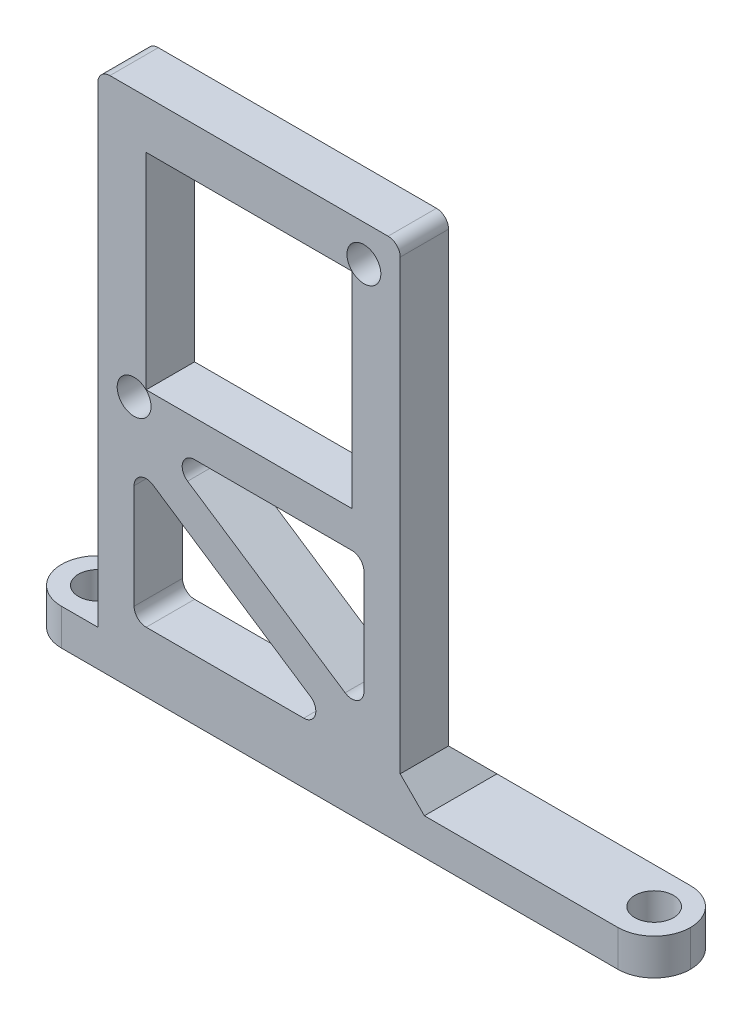
ISO-10303-21;
HEADER;
FILE_DESCRIPTION(('STEP AP214'),'2;1');
FILE_NAME('part.step','',(''),(''),'','','');
FILE_SCHEMA(('AUTOMOTIVE_DESIGN { 1 0 10303 214 1 1 1 1 }'));
ENDSEC;
DATA;
#1=APPLICATION_CONTEXT('core data for automotive mechanical design processes');
#2=APPLICATION_PROTOCOL_DEFINITION('international standard','automotive_design',2000,#1);
#3=PRODUCT_CONTEXT('',#1,'mechanical');
#4=PRODUCT('Part','Part','',(#3));
#5=PRODUCT_RELATED_PRODUCT_CATEGORY('part','',(#4));
#6=PRODUCT_DEFINITION_FORMATION('','',#4);
#7=PRODUCT_DEFINITION_CONTEXT('part definition',#1,'design');
#8=PRODUCT_DEFINITION('design','',#6,#7);
#9=PRODUCT_DEFINITION_SHAPE('','',#8);
#10=(LENGTH_UNIT() NAMED_UNIT(*) SI_UNIT(.MILLI.,.METRE.));
#11=(NAMED_UNIT(*) PLANE_ANGLE_UNIT() SI_UNIT($,.RADIAN.));
#12=(NAMED_UNIT(*) SI_UNIT($,.STERADIAN.) SOLID_ANGLE_UNIT());
#13=UNCERTAINTY_MEASURE_WITH_UNIT(LENGTH_MEASURE(1.E-05),#10,'distance_accuracy_value','');
#14=(GEOMETRIC_REPRESENTATION_CONTEXT(3) GLOBAL_UNCERTAINTY_ASSIGNED_CONTEXT((#13)) GLOBAL_UNIT_ASSIGNED_CONTEXT((#10,
#11,#12)) REPRESENTATION_CONTEXT('',''));
#15=CARTESIAN_POINT('',(0.,0.,0.));
#16=DIRECTION('',(0.,0.,1.));
#17=DIRECTION('',(1.,0.,0.));
#18=AXIS2_PLACEMENT_3D('',#15,#16,#17);
#19=CARTESIAN_POINT('',(0.,3.,0.));
#20=DIRECTION('',(0.,-1.,0.));
#21=DIRECTION('',(0.,0.,-1.));
#22=AXIS2_PLACEMENT_3D('',#19,#20,#21);
#23=PLANE('',#22);
#24=CARTESIAN_POINT('',(23.,3.,0.));
#25=DIRECTION('',(0.,1.,0.));
#26=DIRECTION('',(0.,0.,1.));
#27=AXIS2_PLACEMENT_3D('',#24,#25,#26);
#28=CIRCLE('',#27,1.6);
#29=CARTESIAN_POINT('',(23.,3.,1.6));
#30=VERTEX_POINT('',#29);
#31=EDGE_CURVE('E273',#30,#30,#28,.T.);
#32=ORIENTED_EDGE('',*,*,#31,.F.);
#33=EDGE_LOOP('',(#32));
#34=FACE_BOUND('',#33,.T.);
#35=DIRECTION('',(-1.,0.,0.));
#36=VECTOR('',#35,1.);
#37=CARTESIAN_POINT('',(26.,3.,-3.));
#38=LINE('',#37,#36);
#39=CARTESIAN_POINT('',(23.,3.,-3.));
#40=VERTEX_POINT('',#39);
#41=CARTESIAN_POINT('',(7.00000000000001,3.,-3.));
#42=VERTEX_POINT('',#41);
#43=EDGE_CURVE('E303',#40,#42,#38,.T.);
#44=ORIENTED_EDGE('',*,*,#43,.T.);
#45=DIRECTION('',(0.,0.,1.));
#46=VECTOR('',#45,1.);
#47=CARTESIAN_POINT('',(7.00000000000001,3.,3.));
#48=LINE('',#47,#46);
#49=CARTESIAN_POINT('',(7.00000000000001,3.,3.));
#50=VERTEX_POINT('',#49);
#51=EDGE_CURVE('E333',#42,#50,#48,.T.);
#52=ORIENTED_EDGE('',*,*,#51,.T.);
#53=DIRECTION('',(1.,0.,0.));
#54=VECTOR('',#53,1.);
#55=CARTESIAN_POINT('',(26.,3.,3.));
#56=LINE('',#55,#54);
#57=CARTESIAN_POINT('',(23.,3.,3.));
#58=VERTEX_POINT('',#57);
#59=EDGE_CURVE('E320',#50,#58,#56,.T.);
#60=ORIENTED_EDGE('',*,*,#59,.T.);
#61=CARTESIAN_POINT('',(23.,3.,0.));
#62=DIRECTION('',(0.,-1.,0.));
#63=DIRECTION('',(0.,0.,-1.));
#64=AXIS2_PLACEMENT_3D('',#61,#62,#63);
#65=CIRCLE('',#64,3.);
#66=CARTESIAN_POINT('',(26.,3.,0.));
#67=VERTEX_POINT('',#66);
#68=EDGE_CURVE('E863',#58,#67,#65,.F.);
#69=ORIENTED_EDGE('',*,*,#68,.T.);
#70=CARTESIAN_POINT('',(23.,3.,0.));
#71=DIRECTION('',(0.,-1.,0.));
#72=DIRECTION('',(0.,0.,-1.));
#73=AXIS2_PLACEMENT_3D('',#70,#71,#72);
#74=CIRCLE('',#73,3.);
#75=EDGE_CURVE('E867',#67,#40,#74,.F.);
#76=ORIENTED_EDGE('',*,*,#75,.T.);
#77=EDGE_LOOP('',(#44,#52,#60,#69,#76));
#78=FACE_BOUND('',#77,.T.);
#79=ADVANCED_FACE('F35',(#34,#78),#23,.F.);
#80=CARTESIAN_POINT('',(-23.,3.,0.));
#81=DIRECTION('',(0.,1.,0.));
#82=DIRECTION('',(0.,0.,1.));
#83=AXIS2_PLACEMENT_3D('',#80,#81,#82);
#84=CIRCLE('',#83,1.6);
#85=CARTESIAN_POINT('',(-23.,3.,1.6));
#86=VERTEX_POINT('',#85);
#87=EDGE_CURVE('E272',#86,#86,#84,.T.);
#88=ORIENTED_EDGE('',*,*,#87,.F.);
#89=EDGE_LOOP('',(#88));
#90=FACE_BOUND('',#89,.T.);
#91=DIRECTION('',(0.,0.,1.));
#92=VECTOR('',#91,1.);
#93=CARTESIAN_POINT('',(-20.,3.,-0.999999999999997));
#94=LINE('',#93,#92);
#95=CARTESIAN_POINT('',(-20.,3.,-3.));
#96=VERTEX_POINT('',#95);
#97=CARTESIAN_POINT('',(-20.,3.,3.));
#98=VERTEX_POINT('',#97);
#99=EDGE_CURVE('E280',#96,#98,#94,.T.);
#100=ORIENTED_EDGE('',*,*,#99,.F.);
#101=CARTESIAN_POINT('',(-23.,3.,-3.));
#102=VERTEX_POINT('',#101);
#103=EDGE_CURVE('E319',#96,#102,#38,.T.);
#104=ORIENTED_EDGE('',*,*,#103,.T.);
#105=CARTESIAN_POINT('',(-23.,3.,0.));
#106=DIRECTION('',(0.,-1.,0.));
#107=DIRECTION('',(0.,0.,-1.));
#108=AXIS2_PLACEMENT_3D('',#105,#106,#107);
#109=CIRCLE('',#108,3.);
#110=CARTESIAN_POINT('',(-26.,3.,0.));
#111=VERTEX_POINT('',#110);
#112=EDGE_CURVE('E314',#102,#111,#109,.F.);
#113=ORIENTED_EDGE('',*,*,#112,.T.);
#114=CARTESIAN_POINT('',(-23.,3.,0.));
#115=DIRECTION('',(0.,-1.,0.));
#116=DIRECTION('',(0.,0.,-1.));
#117=AXIS2_PLACEMENT_3D('',#114,#115,#116);
#118=CIRCLE('',#117,3.);
#119=CARTESIAN_POINT('',(-23.,3.,3.));
#120=VERTEX_POINT('',#119);
#121=EDGE_CURVE('E880',#111,#120,#118,.F.);
#122=ORIENTED_EDGE('',*,*,#121,.T.);
#123=EDGE_CURVE('E315',#120,#98,#56,.T.);
#124=ORIENTED_EDGE('',*,*,#123,.T.);
#125=EDGE_LOOP('',(#100,#104,#113,#122,#124));
#126=FACE_BOUND('',#125,.T.);
#127=ADVANCED_FACE('F545',(#90,#126),#23,.F.);
#128=CARTESIAN_POINT('',(26.,3.,3.));
#129=DIRECTION('',(0.,0.,-1.));
#130=DIRECTION('',(-1.,0.,0.));
#131=AXIS2_PLACEMENT_3D('',#128,#129,#130);
#132=PLANE('',#131);
#133=DIRECTION('',(0.833414355075511,-0.55264863408324,0.));
#134=VECTOR('',#133,1.);
#135=CARTESIAN_POINT('',(19.0847076162344,-7.42851386348771,3.));
#136=LINE('',#135,#134);
#137=CARTESIAN_POINT('',(-15.4473513659167,15.4701740608865,3.));
#138=VERTEX_POINT('',#137);
#139=CARTESIAN_POINT('',(-2.42280181265317,6.83341435507553,3.));
#140=VERTEX_POINT('',#139);
#141=EDGE_CURVE('E515',#138,#140,#136,.T.);
#142=ORIENTED_EDGE('',*,*,#141,.T.);
#143=CARTESIAN_POINT('',(-2.9754504467364,6.00000000000002,3.));
#144=DIRECTION('',(0.,0.,-1.));
#145=DIRECTION('',(-1.,0.,0.));
#146=AXIS2_PLACEMENT_3D('',#143,#144,#145);
#147=CIRCLE('',#146,1.);
#148=CARTESIAN_POINT('',(-2.9754504467364,5.00000000000002,3.));
#149=VERTEX_POINT('',#148);
#150=EDGE_CURVE('E422',#140,#149,#147,.T.);
#151=ORIENTED_EDGE('',*,*,#150,.T.);
#152=DIRECTION('',(-1.,0.,0.));
#153=VECTOR('',#152,1.);
#154=CARTESIAN_POINT('',(26.,5.00000000000002,3.));
#155=LINE('',#154,#153);
#156=CARTESIAN_POINT('',(-16.,5.00000000000002,3.));
#157=VERTEX_POINT('',#156);
#158=EDGE_CURVE('E511',#149,#157,#155,.T.);
#159=ORIENTED_EDGE('',*,*,#158,.T.);
#160=CARTESIAN_POINT('',(-16.,6.00000000000002,3.));
#161=DIRECTION('',(0.,0.,-1.));
#162=DIRECTION('',(-1.,0.,0.));
#163=AXIS2_PLACEMENT_3D('',#160,#161,#162);
#164=CIRCLE('',#163,1.);
#165=CARTESIAN_POINT('',(-17.,6.00000000000002,3.));
#166=VERTEX_POINT('',#165);
#167=EDGE_CURVE('E414',#157,#166,#164,.T.);
#168=ORIENTED_EDGE('',*,*,#167,.T.);
#169=DIRECTION('',(0.,1.,0.));
#170=VECTOR('',#169,1.);
#171=CARTESIAN_POINT('',(-17.,2.99999999999999,3.));
#172=LINE('',#171,#170);
#173=CARTESIAN_POINT('',(-17.,14.636759705811,3.));
#174=VERTEX_POINT('',#173);
#175=EDGE_CURVE('E518',#166,#174,#172,.T.);
#176=ORIENTED_EDGE('',*,*,#175,.T.);
#177=CARTESIAN_POINT('',(-16.,14.636759705811,3.));
#178=DIRECTION('',(0.,0.,-1.));
#179=DIRECTION('',(-1.,0.,0.));
#180=AXIS2_PLACEMENT_3D('',#177,#178,#179);
#181=CIRCLE('',#180,1.);
#182=EDGE_CURVE('E418',#174,#138,#181,.T.);
#183=ORIENTED_EDGE('',*,*,#182,.T.);
#184=EDGE_LOOP('',(#142,#151,#159,#168,#176,#183));
#185=FACE_BOUND('',#184,.T.);
#186=DIRECTION('',(0.,-1.,0.));
#187=VECTOR('',#186,1.);
#188=CARTESIAN_POINT('',(2.00000000000001,3.,3.));
#189=LINE('',#188,#187);
#190=CARTESIAN_POINT('',(2.00000000000001,18.,3.));
#191=VERTEX_POINT('',#190);
#192=CARTESIAN_POINT('',(2.00000000000001,9.36324029418904,3.));
#193=VERTEX_POINT('',#192);
#194=EDGE_CURVE('E449',#191,#193,#189,.T.);
#195=ORIENTED_EDGE('',*,*,#194,.T.);
#196=CARTESIAN_POINT('',(1.00000000000001,9.36324029418904,3.));
#197=DIRECTION('',(0.,0.,-1.));
#198=DIRECTION('',(-1.,0.,0.));
#199=AXIS2_PLACEMENT_3D('',#196,#197,#198);
#200=CIRCLE('',#199,1.);
#201=CARTESIAN_POINT('',(0.447351365916761,8.52982593911354,3.));
#202=VERTEX_POINT('',#201);
#203=EDGE_CURVE('E426',#193,#202,#200,.T.);
#204=ORIENTED_EDGE('',*,*,#203,.T.);
#205=DIRECTION('',(-0.833414355075511,0.55264863408324,0.));
#206=VECTOR('',#205,1.);
#207=CARTESIAN_POINT('',(20.7426535184841,-4.92827079826118,3.));
#208=LINE('',#207,#206);
#209=CARTESIAN_POINT('',(-12.5771981873468,17.1665856449245,3.));
#210=VERTEX_POINT('',#209);
#211=EDGE_CURVE('E458',#202,#210,#208,.T.);
#212=ORIENTED_EDGE('',*,*,#211,.T.);
#213=CARTESIAN_POINT('',(-12.0245495532636,18.,3.));
#214=DIRECTION('',(0.,0.,-1.));
#215=DIRECTION('',(-1.,0.,0.));
#216=AXIS2_PLACEMENT_3D('',#213,#214,#215);
#217=CIRCLE('',#216,1.);
#218=CARTESIAN_POINT('',(-12.0245495532636,19.,3.));
#219=VERTEX_POINT('',#218);
#220=EDGE_CURVE('E11',#210,#219,#217,.T.);
#221=ORIENTED_EDGE('',*,*,#220,.T.);
#222=DIRECTION('',(1.,0.,0.));
#223=VECTOR('',#222,1.);
#224=CARTESIAN_POINT('',(26.,19.,3.));
#225=LINE('',#224,#223);
#226=CARTESIAN_POINT('',(1.00000000000001,19.,3.));
#227=VERTEX_POINT('',#226);
#228=EDGE_CURVE('E347',#219,#227,#225,.T.);
#229=ORIENTED_EDGE('',*,*,#228,.T.);
#230=CARTESIAN_POINT('',(1.00000000000001,18.,3.));
#231=DIRECTION('',(0.,0.,-1.));
#232=DIRECTION('',(-1.,0.,0.));
#233=AXIS2_PLACEMENT_3D('',#230,#231,#232);
#234=CIRCLE('',#233,1.);
#235=EDGE_CURVE('E430',#227,#191,#234,.T.);
#236=ORIENTED_EDGE('',*,*,#235,.T.);
#237=EDGE_LOOP('',(#195,#204,#212,#221,#229,#236));
#238=FACE_BOUND('',#237,.T.);
#239=DIRECTION('',(1.,0.,0.));
#240=VECTOR('',#239,1.);
#241=CARTESIAN_POINT('',(-16.,22.,3.));
#242=LINE('',#241,#240);
#243=CARTESIAN_POINT('',(-16.,22.,3.));
#244=VERTEX_POINT('',#243);
#245=CARTESIAN_POINT('',(1.00000000000002,22.,3.));
#246=VERTEX_POINT('',#245);
#247=EDGE_CURVE('E242',#244,#246,#242,.T.);
#248=ORIENTED_EDGE('',*,*,#247,.F.);
#249=DIRECTION('',(0.,-1.,0.));
#250=VECTOR('',#249,1.);
#251=CARTESIAN_POINT('',(-16.,39.,3.));
#252=LINE('',#251,#250);
#253=CARTESIAN_POINT('',(-16.,39.,3.));
#254=VERTEX_POINT('',#253);
#255=EDGE_CURVE('E247',#254,#244,#252,.T.);
#256=ORIENTED_EDGE('',*,*,#255,.F.);
#257=DIRECTION('',(-1.,0.,0.));
#258=VECTOR('',#257,1.);
#259=CARTESIAN_POINT('',(-16.,39.,3.));
#260=LINE('',#259,#258);
#261=CARTESIAN_POINT('',(1.00000000000001,39.,3.));
#262=VERTEX_POINT('',#261);
#263=EDGE_CURVE('E252',#262,#254,#260,.T.);
#264=ORIENTED_EDGE('',*,*,#263,.F.);
#265=DIRECTION('',(0.,1.,0.));
#266=VECTOR('',#265,1.);
#267=CARTESIAN_POINT('',(1.00000000000001,39.,3.));
#268=LINE('',#267,#266);
#269=EDGE_CURVE('E231',#246,#262,#268,.T.);
#270=ORIENTED_EDGE('',*,*,#269,.F.);
#271=EDGE_LOOP('',(#248,#256,#264,#270));
#272=FACE_BOUND('',#271,.T.);
#273=CARTESIAN_POINT('',(-17.,21.,3.));
#274=DIRECTION('',(0.,0.,1.));
#275=DIRECTION('',(1.,0.,0.));
#276=AXIS2_PLACEMENT_3D('',#273,#274,#275);
#277=CIRCLE('',#276,1.4);
#278=CARTESIAN_POINT('',(-15.6,21.,3.));
#279=VERTEX_POINT('',#278);
#280=EDGE_CURVE('E259',#279,#279,#277,.T.);
#281=ORIENTED_EDGE('',*,*,#280,.F.);
#282=EDGE_LOOP('',(#281));
#283=FACE_BOUND('',#282,.T.);
#284=CARTESIAN_POINT('',(2.00000000000002,40.,3.));
#285=DIRECTION('',(0.,0.,1.));
#286=DIRECTION('',(1.,0.,0.));
#287=AXIS2_PLACEMENT_3D('',#284,#285,#286);
#288=CIRCLE('',#287,1.4);
#289=CARTESIAN_POINT('',(3.40000000000002,40.,3.));
#290=VERTEX_POINT('',#289);
#291=EDGE_CURVE('E265',#290,#290,#288,.T.);
#292=ORIENTED_EDGE('',*,*,#291,.F.);
#293=EDGE_LOOP('',(#292));
#294=FACE_BOUND('',#293,.T.);
#295=DIRECTION('',(0.,-1.,0.));
#296=VECTOR('',#295,1.);
#297=CARTESIAN_POINT('',(5.00000000000001,43.,3.));
#298=LINE('',#297,#296);
#299=CARTESIAN_POINT('',(5.00000000000001,42.,3.));
#300=VERTEX_POINT('',#299);
#301=CARTESIAN_POINT('',(5.00000000000001,5.00000000000002,3.));
#302=VERTEX_POINT('',#301);
#303=EDGE_CURVE('E358',#300,#302,#298,.T.);
#304=ORIENTED_EDGE('',*,*,#303,.F.);
#305=CARTESIAN_POINT('',(4.00000000000001,42.,3.));
#306=DIRECTION('',(0.,0.,-1.));
#307=DIRECTION('',(-1.,0.,0.));
#308=AXIS2_PLACEMENT_3D('',#305,#306,#307);
#309=CIRCLE('',#308,1.);
#310=CARTESIAN_POINT('',(4.00000000000001,43.,3.));
#311=VERTEX_POINT('',#310);
#312=EDGE_CURVE('E377',#300,#311,#309,.F.);
#313=ORIENTED_EDGE('',*,*,#312,.T.);
#314=DIRECTION('',(1.,0.,0.));
#315=VECTOR('',#314,1.);
#316=CARTESIAN_POINT('',(-20.,43.,3.));
#317=LINE('',#316,#315);
#318=CARTESIAN_POINT('',(-19.,43.,3.));
#319=VERTEX_POINT('',#318);
#320=EDGE_CURVE('E283',#319,#311,#317,.T.);
#321=ORIENTED_EDGE('',*,*,#320,.F.);
#322=CARTESIAN_POINT('',(-19.,42.,3.));
#323=DIRECTION('',(0.,0.,-1.));
#324=DIRECTION('',(-1.,0.,0.));
#325=AXIS2_PLACEMENT_3D('',#322,#323,#324);
#326=CIRCLE('',#325,1.);
#327=CARTESIAN_POINT('',(-20.,42.,3.));
#328=VERTEX_POINT('',#327);
#329=EDGE_CURVE('E375',#319,#328,#326,.F.);
#330=ORIENTED_EDGE('',*,*,#329,.T.);
#331=DIRECTION('',(0.,-1.,0.));
#332=VECTOR('',#331,1.);
#333=CARTESIAN_POINT('',(-20.,43.,3.));
#334=LINE('',#333,#332);
#335=EDGE_CURVE('E360',#328,#98,#334,.T.);
#336=ORIENTED_EDGE('',*,*,#335,.T.);
#337=ORIENTED_EDGE('',*,*,#123,.F.);
#338=DIRECTION('',(0.,-1.,0.));
#339=VECTOR('',#338,1.);
#340=CARTESIAN_POINT('',(-23.,3.,3.));
#341=LINE('',#340,#339);
#342=CARTESIAN_POINT('',(-23.,0.,3.));
#343=VERTEX_POINT('',#342);
#344=EDGE_CURVE('E884',#120,#343,#341,.T.);
#345=ORIENTED_EDGE('',*,*,#344,.T.);
#346=DIRECTION('',(1.,0.,0.));
#347=VECTOR('',#346,1.);
#348=CARTESIAN_POINT('',(26.,0.,3.));
#349=LINE('',#348,#347);
#350=CARTESIAN_POINT('',(23.,0.,3.));
#351=VERTEX_POINT('',#350);
#352=EDGE_CURVE('E365',#343,#351,#349,.T.);
#353=ORIENTED_EDGE('',*,*,#352,.T.);
#354=DIRECTION('',(0.,-1.,0.));
#355=VECTOR('',#354,1.);
#356=CARTESIAN_POINT('',(23.,3.,3.));
#357=LINE('',#356,#355);
#358=EDGE_CURVE('E478',#351,#58,#357,.F.);
#359=ORIENTED_EDGE('',*,*,#358,.T.);
#360=ORIENTED_EDGE('',*,*,#59,.F.);
#361=DIRECTION('',(0.707106781186543,-0.707106781186552,0.));
#362=VECTOR('',#361,1.);
#363=CARTESIAN_POINT('',(16.4999999999999,-6.5,3.));
#364=LINE('',#363,#362);
#365=EDGE_CURVE('E337',#50,#302,#364,.F.);
#366=ORIENTED_EDGE('',*,*,#365,.T.);
#367=EDGE_LOOP('',(#304,#313,#321,#330,#336,#337,#345,#353,#359,#360,#366));
#368=FACE_BOUND('',#367,.T.);
#369=ADVANCED_FACE('F249',(#185,#238,#272,#283,#294,#368),#132,.F.);
#370=CARTESIAN_POINT('',(26.,3.,-3.));
#371=DIRECTION('',(0.,0.,1.));
#372=DIRECTION('',(1.,0.,0.));
#373=AXIS2_PLACEMENT_3D('',#370,#371,#372);
#374=PLANE('',#373);
#375=ORIENTED_EDGE('',*,*,#43,.F.);
#376=DIRECTION('',(0.,-1.,0.));
#377=VECTOR('',#376,1.);
#378=CARTESIAN_POINT('',(23.,3.,-3.));
#379=LINE('',#378,#377);
#380=CARTESIAN_POINT('',(23.,0.,-3.));
#381=VERTEX_POINT('',#380);
#382=EDGE_CURVE('E302',#40,#381,#379,.T.);
#383=ORIENTED_EDGE('',*,*,#382,.T.);
#384=DIRECTION('',(-1.,0.,0.));
#385=VECTOR('',#384,1.);
#386=CARTESIAN_POINT('',(26.,0.,-3.));
#387=LINE('',#386,#385);
#388=CARTESIAN_POINT('',(-23.,0.,-3.));
#389=VERTEX_POINT('',#388);
#390=EDGE_CURVE('E330',#381,#389,#387,.T.);
#391=ORIENTED_EDGE('',*,*,#390,.T.);
#392=DIRECTION('',(0.,-1.,0.));
#393=VECTOR('',#392,1.);
#394=CARTESIAN_POINT('',(-23.,3.,-3.));
#395=LINE('',#394,#393);
#396=EDGE_CURVE('E299',#389,#102,#395,.F.);
#397=ORIENTED_EDGE('',*,*,#396,.T.);
#398=ORIENTED_EDGE('',*,*,#103,.F.);
#399=EDGE_CURVE('E869',#42,#96,#38,.T.);
#400=ORIENTED_EDGE('',*,*,#399,.F.);
#401=EDGE_LOOP('',(#375,#383,#391,#397,#398,#400));
#402=FACE_BOUND('',#401,.T.);
#403=ADVANCED_FACE('F561',(#402),#374,.F.);
#404=CARTESIAN_POINT('',(0.,0.,0.));
#405=DIRECTION('',(0.,-1.,0.));
#406=DIRECTION('',(0.,0.,-1.));
#407=AXIS2_PLACEMENT_3D('',#404,#405,#406);
#408=PLANE('',#407);
#409=CARTESIAN_POINT('',(23.,0.,0.));
#410=DIRECTION('',(0.,1.,0.));
#411=DIRECTION('',(0.,0.,1.));
#412=AXIS2_PLACEMENT_3D('',#409,#410,#411);
#413=CIRCLE('',#412,1.6);
#414=CARTESIAN_POINT('',(23.,0.,1.6));
#415=VERTEX_POINT('',#414);
#416=EDGE_CURVE('E269',#415,#415,#413,.T.);
#417=ORIENTED_EDGE('',*,*,#416,.T.);
#418=EDGE_LOOP('',(#417));
#419=FACE_BOUND('',#418,.T.);
#420=CARTESIAN_POINT('',(-23.,0.,0.));
#421=DIRECTION('',(0.,1.,0.));
#422=DIRECTION('',(0.,0.,1.));
#423=AXIS2_PLACEMENT_3D('',#420,#421,#422);
#424=CIRCLE('',#423,1.6);
#425=CARTESIAN_POINT('',(-23.,0.,1.6));
#426=VERTEX_POINT('',#425);
#427=EDGE_CURVE('E277',#426,#426,#424,.T.);
#428=ORIENTED_EDGE('',*,*,#427,.T.);
#429=EDGE_LOOP('',(#428));
#430=FACE_BOUND('',#429,.T.);
#431=ORIENTED_EDGE('',*,*,#390,.F.);
#432=CARTESIAN_POINT('',(23.,0.,0.));
#433=DIRECTION('',(0.,-1.,0.));
#434=DIRECTION('',(0.,0.,-1.));
#435=AXIS2_PLACEMENT_3D('',#432,#433,#434);
#436=CIRCLE('',#435,3.);
#437=CARTESIAN_POINT('',(26.,0.,0.));
#438=VERTEX_POINT('',#437);
#439=EDGE_CURVE('E312',#381,#438,#436,.T.);
#440=ORIENTED_EDGE('',*,*,#439,.T.);
#441=CARTESIAN_POINT('',(23.,0.,0.));
#442=DIRECTION('',(0.,-1.,0.));
#443=DIRECTION('',(0.,0.,-1.));
#444=AXIS2_PLACEMENT_3D('',#441,#442,#443);
#445=CIRCLE('',#444,3.);
#446=EDGE_CURVE('E310',#438,#351,#445,.T.);
#447=ORIENTED_EDGE('',*,*,#446,.T.);
#448=ORIENTED_EDGE('',*,*,#352,.F.);
#449=CARTESIAN_POINT('',(-23.,0.,0.));
#450=DIRECTION('',(0.,-1.,0.));
#451=DIRECTION('',(0.,0.,-1.));
#452=AXIS2_PLACEMENT_3D('',#449,#450,#451);
#453=CIRCLE('',#452,3.);
#454=CARTESIAN_POINT('',(-26.,0.,0.));
#455=VERTEX_POINT('',#454);
#456=EDGE_CURVE('E308',#343,#455,#453,.T.);
#457=ORIENTED_EDGE('',*,*,#456,.T.);
#458=CARTESIAN_POINT('',(-23.,0.,0.));
#459=DIRECTION('',(0.,-1.,0.));
#460=DIRECTION('',(0.,0.,-1.));
#461=AXIS2_PLACEMENT_3D('',#458,#459,#460);
#462=CIRCLE('',#461,3.);
#463=EDGE_CURVE('E306',#455,#389,#462,.T.);
#464=ORIENTED_EDGE('',*,*,#463,.T.);
#465=EDGE_LOOP('',(#431,#440,#447,#448,#457,#464));
#466=FACE_BOUND('',#465,.T.);
#467=ADVANCED_FACE('F558',(#419,#430,#466),#408,.T.);
#468=CARTESIAN_POINT('',(-20.,43.,-0.999999999999997));
#469=DIRECTION('',(1.,0.,0.));
#470=DIRECTION('',(0.,0.,-1.));
#471=AXIS2_PLACEMENT_3D('',#468,#469,#470);
#472=PLANE('',#471);
#473=ORIENTED_EDGE('',*,*,#335,.F.);
#474=DIRECTION('',(0.,0.,1.));
#475=VECTOR('',#474,1.);
#476=CARTESIAN_POINT('',(-20.,42.,-0.999999999999997));
#477=LINE('',#476,#475);
#478=CARTESIAN_POINT('',(-20.,42.,-0.999999999999997));
#479=VERTEX_POINT('',#478);
#480=EDGE_CURVE('E379',#328,#479,#477,.F.);
#481=ORIENTED_EDGE('',*,*,#480,.T.);
#482=DIRECTION('',(0.,-1.,0.));
#483=VECTOR('',#482,1.);
#484=CARTESIAN_POINT('',(-20.,43.,-0.999999999999997));
#485=LINE('',#484,#483);
#486=CARTESIAN_POINT('',(-20.,5.00000000000002,-0.999999999999997));
#487=VERTEX_POINT('',#486);
#488=EDGE_CURVE('E289',#479,#487,#485,.T.);
#489=ORIENTED_EDGE('',*,*,#488,.T.);
#490=DIRECTION('',(0.,0.707106781186552,0.707106781186543));
#491=VECTOR('',#490,1.);
#492=CARTESIAN_POINT('',(-20.,24.0000000000002,18.));
#493=LINE('',#492,#491);
#494=EDGE_CURVE('E340',#487,#96,#493,.F.);
#495=ORIENTED_EDGE('',*,*,#494,.T.);
#496=ORIENTED_EDGE('',*,*,#99,.T.);
#497=EDGE_LOOP('',(#473,#481,#489,#495,#496));
#498=FACE_BOUND('',#497,.T.);
#499=ADVANCED_FACE('F556',(#498),#472,.F.);
#500=CARTESIAN_POINT('',(5.00000000000001,43.,-0.999999999999997));
#501=DIRECTION('',(-1.,0.,0.));
#502=DIRECTION('',(0.,0.,1.));
#503=AXIS2_PLACEMENT_3D('',#500,#501,#502);
#504=PLANE('',#503);
#505=DIRECTION('',(0.,-1.,0.));
#506=VECTOR('',#505,1.);
#507=CARTESIAN_POINT('',(5.00000000000001,43.,-0.999999999999997));
#508=LINE('',#507,#506);
#509=CARTESIAN_POINT('',(5.00000000000001,42.,-0.999999999999997));
#510=VERTEX_POINT('',#509);
#511=CARTESIAN_POINT('',(5.00000000000001,5.00000000000002,-0.999999999999997));
#512=VERTEX_POINT('',#511);
#513=EDGE_CURVE('E324',#510,#512,#508,.T.);
#514=ORIENTED_EDGE('',*,*,#513,.F.);
#515=DIRECTION('',(0.,0.,-1.));
#516=VECTOR('',#515,1.);
#517=CARTESIAN_POINT('',(5.00000000000001,42.,3.));
#518=LINE('',#517,#516);
#519=EDGE_CURVE('E357',#510,#300,#518,.F.);
#520=ORIENTED_EDGE('',*,*,#519,.T.);
#521=ORIENTED_EDGE('',*,*,#303,.T.);
#522=DIRECTION('',(0.,0.,-1.));
#523=VECTOR('',#522,1.);
#524=CARTESIAN_POINT('',(5.00000000000001,5.00000000000002,-0.999999999999997));
#525=LINE('',#524,#523);
#526=EDGE_CURVE('E331',#302,#512,#525,.T.);
#527=ORIENTED_EDGE('',*,*,#526,.T.);
#528=EDGE_LOOP('',(#514,#520,#521,#527));
#529=FACE_BOUND('',#528,.T.);
#530=ADVANCED_FACE('F485',(#529),#504,.F.);
#531=CARTESIAN_POINT('',(-20.,43.,-0.999999999999997));
#532=DIRECTION('',(0.,0.,1.));
#533=DIRECTION('',(1.,0.,0.));
#534=AXIS2_PLACEMENT_3D('',#531,#532,#533);
#535=PLANE('',#534);
#536=DIRECTION('',(0.,-1.,0.));
#537=VECTOR('',#536,1.);
#538=CARTESIAN_POINT('',(2.00000000000001,19.,-0.999999999999997));
#539=LINE('',#538,#537);
#540=CARTESIAN_POINT('',(2.00000000000001,18.,-0.999999999999997));
#541=VERTEX_POINT('',#540);
#542=CARTESIAN_POINT('',(2.00000000000001,9.36324029418904,-0.999999999999997));
#543=VERTEX_POINT('',#542);
#544=EDGE_CURVE('E450',#541,#543,#539,.T.);
#545=ORIENTED_EDGE('',*,*,#544,.F.);
#546=CARTESIAN_POINT('',(1.00000000000001,18.,-0.999999999999997));
#547=DIRECTION('',(0.,0.,1.));
#548=DIRECTION('',(1.,0.,0.));
#549=AXIS2_PLACEMENT_3D('',#546,#547,#548);
#550=CIRCLE('',#549,1.);
#551=CARTESIAN_POINT('',(1.00000000000001,19.,-0.999999999999997));
#552=VERTEX_POINT('',#551);
#553=EDGE_CURVE('E428',#541,#552,#550,.T.);
#554=ORIENTED_EDGE('',*,*,#553,.T.);
#555=DIRECTION('',(1.,0.,0.));
#556=VECTOR('',#555,1.);
#557=CARTESIAN_POINT('',(-15.3420540977503,19.,-0.999999999999997));
#558=LINE('',#557,#556);
#559=CARTESIAN_POINT('',(-12.0245495532636,19.,-0.999999999999997));
#560=VERTEX_POINT('',#559);
#561=EDGE_CURVE('E440',#560,#552,#558,.T.);
#562=ORIENTED_EDGE('',*,*,#561,.F.);
#563=CARTESIAN_POINT('',(-12.0245495532636,18.,-0.999999999999997));
#564=DIRECTION('',(0.,0.,1.));
#565=DIRECTION('',(1.,0.,0.));
#566=AXIS2_PLACEMENT_3D('',#563,#564,#565);
#567=CIRCLE('',#566,1.);
#568=CARTESIAN_POINT('',(-12.5771981873468,17.1665856449245,-0.999999999999997));
#569=VERTEX_POINT('',#568);
#570=EDGE_CURVE('E44',#560,#569,#567,.T.);
#571=ORIENTED_EDGE('',*,*,#570,.T.);
#572=DIRECTION('',(-0.833414355075511,0.55264863408324,0.));
#573=VECTOR('',#572,1.);
#574=CARTESIAN_POINT('',(2.00000000000001,7.50024306522655,-0.999999999999997));
#575=LINE('',#574,#573);
#576=CARTESIAN_POINT('',(0.447351365916772,8.52982593911353,-0.999999999999997));
#577=VERTEX_POINT('',#576);
#578=EDGE_CURVE('E438',#577,#569,#575,.T.);
#579=ORIENTED_EDGE('',*,*,#578,.F.);
#580=CARTESIAN_POINT('',(1.00000000000001,9.36324029418904,-0.999999999999997));
#581=DIRECTION('',(0.,0.,1.));
#582=DIRECTION('',(1.,0.,0.));
#583=AXIS2_PLACEMENT_3D('',#580,#581,#582);
#584=CIRCLE('',#583,1.);
#585=EDGE_CURVE('E424',#577,#543,#584,.T.);
#586=ORIENTED_EDGE('',*,*,#585,.T.);
#587=EDGE_LOOP('',(#545,#554,#562,#571,#579,#586));
#588=FACE_BOUND('',#587,.T.);
#589=DIRECTION('',(-1.,0.,0.));
#590=VECTOR('',#589,1.);
#591=CARTESIAN_POINT('',(-20.,39.,-0.999999999999997));
#592=LINE('',#591,#590);
#593=CARTESIAN_POINT('',(1.00000000000001,39.,-0.999999999999997));
#594=VERTEX_POINT('',#593);
#595=CARTESIAN_POINT('',(-16.,39.,-0.999999999999997));
#596=VERTEX_POINT('',#595);
#597=EDGE_CURVE('E473',#594,#596,#592,.T.);
#598=ORIENTED_EDGE('',*,*,#597,.T.);
#599=DIRECTION('',(0.,-1.,0.));
#600=VECTOR('',#599,1.);
#601=CARTESIAN_POINT('',(-16.,43.,-0.999999999999997));
#602=LINE('',#601,#600);
#603=CARTESIAN_POINT('',(-16.,22.,-0.999999999999997));
#604=VERTEX_POINT('',#603);
#605=EDGE_CURVE('E469',#596,#604,#602,.T.);
#606=ORIENTED_EDGE('',*,*,#605,.T.);
#607=DIRECTION('',(1.,0.,0.));
#608=VECTOR('',#607,1.);
#609=CARTESIAN_POINT('',(-20.,22.,-0.999999999999997));
#610=LINE('',#609,#608);
#611=CARTESIAN_POINT('',(1.00000000000001,22.,-0.999999999999997));
#612=VERTEX_POINT('',#611);
#613=EDGE_CURVE('E475',#604,#612,#610,.T.);
#614=ORIENTED_EDGE('',*,*,#613,.T.);
#615=DIRECTION('',(0.,1.,0.));
#616=VECTOR('',#615,1.);
#617=CARTESIAN_POINT('',(1.00000000000001,43.,-0.999999999999997));
#618=LINE('',#617,#616);
#619=EDGE_CURVE('E234',#612,#594,#618,.T.);
#620=ORIENTED_EDGE('',*,*,#619,.T.);
#621=EDGE_LOOP('',(#598,#606,#614,#620));
#622=FACE_BOUND('',#621,.T.);
#623=CARTESIAN_POINT('',(-17.,21.,-0.999999999999997));
#624=DIRECTION('',(0.,0.,1.));
#625=DIRECTION('',(1.,0.,0.));
#626=AXIS2_PLACEMENT_3D('',#623,#624,#625);
#627=CIRCLE('',#626,1.4);
#628=CARTESIAN_POINT('',(-15.6,21.,-0.999999999999997));
#629=VERTEX_POINT('',#628);
#630=EDGE_CURVE('E264',#629,#629,#627,.T.);
#631=ORIENTED_EDGE('',*,*,#630,.T.);
#632=EDGE_LOOP('',(#631));
#633=FACE_BOUND('',#632,.T.);
#634=CARTESIAN_POINT('',(2.00000000000002,40.,-0.999999999999997));
#635=DIRECTION('',(0.,0.,1.));
#636=DIRECTION('',(1.,0.,0.));
#637=AXIS2_PLACEMENT_3D('',#634,#635,#636);
#638=CIRCLE('',#637,1.4);
#639=CARTESIAN_POINT('',(3.40000000000002,40.,-0.999999999999997));
#640=VERTEX_POINT('',#639);
#641=EDGE_CURVE('E268',#640,#640,#638,.T.);
#642=ORIENTED_EDGE('',*,*,#641,.T.);
#643=EDGE_LOOP('',(#642));
#644=FACE_BOUND('',#643,.T.);
#645=DIRECTION('',(-1.,0.,0.));
#646=VECTOR('',#645,1.);
#647=CARTESIAN_POINT('',(-20.,43.,-0.999999999999997));
#648=LINE('',#647,#646);
#649=CARTESIAN_POINT('',(4.00000000000001,43.,-0.999999999999997));
#650=VERTEX_POINT('',#649);
#651=CARTESIAN_POINT('',(-19.,43.,-0.999999999999997));
#652=VERTEX_POINT('',#651);
#653=EDGE_CURVE('E286',#650,#652,#648,.T.);
#654=ORIENTED_EDGE('',*,*,#653,.F.);
#655=CARTESIAN_POINT('',(4.00000000000001,42.,-0.999999999999997));
#656=DIRECTION('',(0.,0.,1.));
#657=DIRECTION('',(1.,0.,0.));
#658=AXIS2_PLACEMENT_3D('',#655,#656,#657);
#659=CIRCLE('',#658,1.);
#660=EDGE_CURVE('E355',#650,#510,#659,.F.);
#661=ORIENTED_EDGE('',*,*,#660,.T.);
#662=ORIENTED_EDGE('',*,*,#513,.T.);
#663=DIRECTION('',(-1.,0.,0.));
#664=VECTOR('',#663,1.);
#665=CARTESIAN_POINT('',(-20.,5.00000000000002,-0.999999999999997));
#666=LINE('',#665,#664);
#667=CARTESIAN_POINT('',(-2.9754504467364,5.00000000000002,-0.999999999999997));
#668=VERTEX_POINT('',#667);
#669=EDGE_CURVE('E335',#512,#668,#666,.T.);
#670=ORIENTED_EDGE('',*,*,#669,.T.);
#671=CARTESIAN_POINT('',(-2.9754504467364,6.00000000000002,-0.999999999999997));
#672=DIRECTION('',(0.,0.,1.));
#673=DIRECTION('',(1.,0.,0.));
#674=AXIS2_PLACEMENT_3D('',#671,#672,#673);
#675=CIRCLE('',#674,1.);
#676=CARTESIAN_POINT('',(-2.42280181265317,6.83341435507553,-0.999999999999997));
#677=VERTEX_POINT('',#676);
#678=EDGE_CURVE('E420',#668,#677,#675,.T.);
#679=ORIENTED_EDGE('',*,*,#678,.T.);
#680=DIRECTION('',(0.833414355075511,-0.55264863408324,0.));
#681=VECTOR('',#680,1.);
#682=CARTESIAN_POINT('',(-17.,16.4997569347735,-0.999999999999997));
#683=LINE('',#682,#681);
#684=CARTESIAN_POINT('',(-15.4473513659167,15.4701740608865,-0.999999999999997));
#685=VERTEX_POINT('',#684);
#686=EDGE_CURVE('E520',#685,#677,#683,.T.);
#687=ORIENTED_EDGE('',*,*,#686,.F.);
#688=CARTESIAN_POINT('',(-16.,14.636759705811,-0.999999999999997));
#689=DIRECTION('',(0.,0.,1.));
#690=DIRECTION('',(1.,0.,0.));
#691=AXIS2_PLACEMENT_3D('',#688,#689,#690);
#692=CIRCLE('',#691,1.);
#693=CARTESIAN_POINT('',(-17.,14.636759705811,-0.999999999999997));
#694=VERTEX_POINT('',#693);
#695=EDGE_CURVE('E416',#685,#694,#692,.T.);
#696=ORIENTED_EDGE('',*,*,#695,.T.);
#697=DIRECTION('',(0.,1.,0.));
#698=VECTOR('',#697,1.);
#699=CARTESIAN_POINT('',(-17.,5.00000000000002,-0.999999999999997));
#700=LINE('',#699,#698);
#701=CARTESIAN_POINT('',(-17.,6.00000000000002,-0.999999999999997));
#702=VERTEX_POINT('',#701);
#703=EDGE_CURVE('E902',#702,#694,#700,.T.);
#704=ORIENTED_EDGE('',*,*,#703,.F.);
#705=CARTESIAN_POINT('',(-16.,6.00000000000002,-0.999999999999997));
#706=DIRECTION('',(0.,0.,1.));
#707=DIRECTION('',(1.,0.,0.));
#708=AXIS2_PLACEMENT_3D('',#705,#706,#707);
#709=CIRCLE('',#708,1.);
#710=CARTESIAN_POINT('',(-16.,5.00000000000002,-0.999999999999997));
#711=VERTEX_POINT('',#710);
#712=EDGE_CURVE('E411',#702,#711,#709,.T.);
#713=ORIENTED_EDGE('',*,*,#712,.T.);
#714=EDGE_CURVE('E50',#711,#487,#666,.T.);
#715=ORIENTED_EDGE('',*,*,#714,.T.);
#716=ORIENTED_EDGE('',*,*,#488,.F.);
#717=CARTESIAN_POINT('',(-19.,42.,-0.999999999999997));
#718=DIRECTION('',(0.,0.,1.));
#719=DIRECTION('',(1.,0.,0.));
#720=AXIS2_PLACEMENT_3D('',#717,#718,#719);
#721=CIRCLE('',#720,1.);
#722=EDGE_CURVE('E353',#479,#652,#721,.F.);
#723=ORIENTED_EDGE('',*,*,#722,.T.);
#724=EDGE_LOOP('',(#654,#661,#662,#670,#679,#687,#696,#704,#713,#715,#716,#723));
#725=FACE_BOUND('',#724,.T.);
#726=ADVANCED_FACE('F436',(#588,#622,#633,#644,#725),#535,.F.);
#727=CARTESIAN_POINT('',(0.,43.,0.));
#728=DIRECTION('',(0.,1.,0.));
#729=DIRECTION('',(0.,0.,1.));
#730=AXIS2_PLACEMENT_3D('',#727,#728,#729);
#731=PLANE('',#730);
#732=ORIENTED_EDGE('',*,*,#320,.T.);
#733=DIRECTION('',(0.,0.,-1.));
#734=VECTOR('',#733,1.);
#735=CARTESIAN_POINT('',(4.00000000000001,43.,-0.999999999999997));
#736=LINE('',#735,#734);
#737=EDGE_CURVE('E350',#311,#650,#736,.T.);
#738=ORIENTED_EDGE('',*,*,#737,.T.);
#739=ORIENTED_EDGE('',*,*,#653,.T.);
#740=DIRECTION('',(0.,0.,1.));
#741=VECTOR('',#740,1.);
#742=CARTESIAN_POINT('',(-19.,43.,3.));
#743=LINE('',#742,#741);
#744=EDGE_CURVE('E343',#652,#319,#743,.T.);
#745=ORIENTED_EDGE('',*,*,#744,.T.);
#746=EDGE_LOOP('',(#732,#738,#739,#745));
#747=FACE_BOUND('',#746,.T.);
#748=ADVANCED_FACE('F793',(#747),#731,.T.);
#749=CARTESIAN_POINT('',(-23.,0.,0.));
#750=DIRECTION('',(0.,1.,0.));
#751=DIRECTION('',(0.,0.,1.));
#752=AXIS2_PLACEMENT_3D('',#749,#750,#751);
#753=CYLINDRICAL_SURFACE('',#752,1.6);
#754=ORIENTED_EDGE('',*,*,#427,.F.);
#755=EDGE_LOOP('',(#754));
#756=FACE_BOUND('',#755,.T.);
#757=ORIENTED_EDGE('',*,*,#87,.T.);
#758=EDGE_LOOP('',(#757));
#759=FACE_BOUND('',#758,.T.);
#760=ADVANCED_FACE('F784',(#756,#759),#753,.F.);
#761=CARTESIAN_POINT('',(23.,0.,0.));
#762=DIRECTION('',(0.,1.,0.));
#763=DIRECTION('',(0.,0.,1.));
#764=AXIS2_PLACEMENT_3D('',#761,#762,#763);
#765=CYLINDRICAL_SURFACE('',#764,1.6);
#766=ORIENTED_EDGE('',*,*,#416,.F.);
#767=EDGE_LOOP('',(#766));
#768=FACE_BOUND('',#767,.T.);
#769=ORIENTED_EDGE('',*,*,#31,.T.);
#770=EDGE_LOOP('',(#769));
#771=FACE_BOUND('',#770,.T.);
#772=ADVANCED_FACE('F576',(#768,#771),#765,.F.);
#773=CARTESIAN_POINT('',(23.,3.,0.));
#774=DIRECTION('',(0.,-1.,0.));
#775=DIRECTION('',(0.,0.,-1.));
#776=AXIS2_PLACEMENT_3D('',#773,#774,#775);
#777=CYLINDRICAL_SURFACE('',#776,3.);
#778=DIRECTION('',(0.,-1.,0.));
#779=VECTOR('',#778,1.);
#780=CARTESIAN_POINT('',(26.,3.,0.));
#781=LINE('',#780,#779);
#782=EDGE_CURVE('E276',#67,#438,#781,.T.);
#783=ORIENTED_EDGE('',*,*,#782,.F.);
#784=ORIENTED_EDGE('',*,*,#68,.F.);
#785=ORIENTED_EDGE('',*,*,#358,.F.);
#786=ORIENTED_EDGE('',*,*,#446,.F.);
#787=EDGE_LOOP('',(#783,#784,#785,#786));
#788=FACE_BOUND('',#787,.T.);
#789=ADVANCED_FACE('F572',(#788),#777,.T.);
#790=CARTESIAN_POINT('',(23.,3.,0.));
#791=DIRECTION('',(0.,-1.,0.));
#792=DIRECTION('',(0.,0.,-1.));
#793=AXIS2_PLACEMENT_3D('',#790,#791,#792);
#794=CYLINDRICAL_SURFACE('',#793,3.);
#795=ORIENTED_EDGE('',*,*,#75,.F.);
#796=ORIENTED_EDGE('',*,*,#782,.T.);
#797=ORIENTED_EDGE('',*,*,#439,.F.);
#798=ORIENTED_EDGE('',*,*,#382,.F.);
#799=EDGE_LOOP('',(#795,#796,#797,#798));
#800=FACE_BOUND('',#799,.T.);
#801=ADVANCED_FACE('F568',(#800),#794,.T.);
#802=CARTESIAN_POINT('',(-23.,3.,0.));
#803=DIRECTION('',(0.,-1.,0.));
#804=DIRECTION('',(0.,0.,-1.));
#805=AXIS2_PLACEMENT_3D('',#802,#803,#804);
#806=CYLINDRICAL_SURFACE('',#805,3.);
#807=DIRECTION('',(0.,-1.,0.));
#808=VECTOR('',#807,1.);
#809=CARTESIAN_POINT('',(-26.,3.,0.));
#810=LINE('',#809,#808);
#811=EDGE_CURVE('E878',#111,#455,#810,.T.);
#812=ORIENTED_EDGE('',*,*,#811,.F.);
#813=ORIENTED_EDGE('',*,*,#112,.F.);
#814=ORIENTED_EDGE('',*,*,#396,.F.);
#815=ORIENTED_EDGE('',*,*,#463,.F.);
#816=EDGE_LOOP('',(#812,#813,#814,#815));
#817=FACE_BOUND('',#816,.T.);
#818=ADVANCED_FACE('F571',(#817),#806,.T.);
#819=CARTESIAN_POINT('',(-23.,3.,0.));
#820=DIRECTION('',(0.,-1.,0.));
#821=DIRECTION('',(0.,0.,-1.));
#822=AXIS2_PLACEMENT_3D('',#819,#820,#821);
#823=CYLINDRICAL_SURFACE('',#822,3.);
#824=ORIENTED_EDGE('',*,*,#121,.F.);
#825=ORIENTED_EDGE('',*,*,#811,.T.);
#826=ORIENTED_EDGE('',*,*,#456,.F.);
#827=ORIENTED_EDGE('',*,*,#344,.F.);
#828=EDGE_LOOP('',(#824,#825,#826,#827));
#829=FACE_BOUND('',#828,.T.);
#830=ADVANCED_FACE('F578',(#829),#823,.T.);
#831=CARTESIAN_POINT('',(2.00000000000002,40.,-3.));
#832=DIRECTION('',(0.,0.,1.));
#833=DIRECTION('',(1.,0.,0.));
#834=AXIS2_PLACEMENT_3D('',#831,#832,#833);
#835=CYLINDRICAL_SURFACE('',#834,1.4);
#836=ORIENTED_EDGE('',*,*,#291,.T.);
#837=EDGE_LOOP('',(#836));
#838=FACE_BOUND('',#837,.T.);
#839=ORIENTED_EDGE('',*,*,#641,.F.);
#840=EDGE_LOOP('',(#839));
#841=FACE_BOUND('',#840,.T.);
#842=ADVANCED_FACE('F581',(#838,#841),#835,.F.);
#843=CARTESIAN_POINT('',(-17.,21.,-3.));
#844=DIRECTION('',(0.,0.,1.));
#845=DIRECTION('',(1.,0.,0.));
#846=AXIS2_PLACEMENT_3D('',#843,#844,#845);
#847=CYLINDRICAL_SURFACE('',#846,1.4);
#848=ORIENTED_EDGE('',*,*,#280,.T.);
#849=EDGE_LOOP('',(#848));
#850=FACE_BOUND('',#849,.T.);
#851=ORIENTED_EDGE('',*,*,#630,.F.);
#852=EDGE_LOOP('',(#851));
#853=FACE_BOUND('',#852,.T.);
#854=ADVANCED_FACE('F739',(#850,#853),#847,.F.);
#855=CARTESIAN_POINT('',(-16.,39.,-3.));
#856=DIRECTION('',(-1.,0.,0.));
#857=DIRECTION('',(0.,-1.,0.));
#858=AXIS2_PLACEMENT_3D('',#855,#856,#857);
#859=PLANE('',#858);
#860=DIRECTION('',(0.,0.,1.));
#861=VECTOR('',#860,1.);
#862=CARTESIAN_POINT('',(-16.,39.,-3.));
#863=LINE('',#862,#861);
#864=EDGE_CURVE('E257',#596,#254,#863,.T.);
#865=ORIENTED_EDGE('',*,*,#864,.T.);
#866=ORIENTED_EDGE('',*,*,#255,.T.);
#867=DIRECTION('',(0.,0.,1.));
#868=VECTOR('',#867,1.);
#869=CARTESIAN_POINT('',(-16.,22.,-3.));
#870=LINE('',#869,#868);
#871=EDGE_CURVE('E238',#604,#244,#870,.T.);
#872=ORIENTED_EDGE('',*,*,#871,.F.);
#873=ORIENTED_EDGE('',*,*,#605,.F.);
#874=EDGE_LOOP('',(#865,#866,#872,#873));
#875=FACE_BOUND('',#874,.T.);
#876=ADVANCED_FACE('F466',(#875),#859,.F.);
#877=CARTESIAN_POINT('',(-16.,39.,-3.));
#878=DIRECTION('',(0.,1.,0.));
#879=DIRECTION('',(0.,0.,1.));
#880=AXIS2_PLACEMENT_3D('',#877,#878,#879);
#881=PLANE('',#880);
#882=DIRECTION('',(0.,0.,1.));
#883=VECTOR('',#882,1.);
#884=CARTESIAN_POINT('',(1.00000000000001,39.,-3.));
#885=LINE('',#884,#883);
#886=EDGE_CURVE('E237',#594,#262,#885,.T.);
#887=ORIENTED_EDGE('',*,*,#886,.T.);
#888=ORIENTED_EDGE('',*,*,#263,.T.);
#889=ORIENTED_EDGE('',*,*,#864,.F.);
#890=ORIENTED_EDGE('',*,*,#597,.F.);
#891=EDGE_LOOP('',(#887,#888,#889,#890));
#892=FACE_BOUND('',#891,.T.);
#893=ADVANCED_FACE('F472',(#892),#881,.F.);
#894=CARTESIAN_POINT('',(1.00000000000001,39.,-3.));
#895=DIRECTION('',(1.,0.,0.));
#896=DIRECTION('',(0.,1.,0.));
#897=AXIS2_PLACEMENT_3D('',#894,#895,#896);
#898=PLANE('',#897);
#899=DIRECTION('',(0.,0.,1.));
#900=VECTOR('',#899,1.);
#901=CARTESIAN_POINT('',(1.00000000000002,22.,-3.));
#902=LINE('',#901,#900);
#903=EDGE_CURVE('E226',#612,#246,#902,.T.);
#904=ORIENTED_EDGE('',*,*,#903,.T.);
#905=ORIENTED_EDGE('',*,*,#269,.T.);
#906=ORIENTED_EDGE('',*,*,#886,.F.);
#907=ORIENTED_EDGE('',*,*,#619,.F.);
#908=EDGE_LOOP('',(#904,#905,#906,#907));
#909=FACE_BOUND('',#908,.T.);
#910=ADVANCED_FACE('F228',(#909),#898,.F.);
#911=CARTESIAN_POINT('',(-16.,22.,-3.));
#912=DIRECTION('',(0.,-1.,0.));
#913=DIRECTION('',(0.,0.,-1.));
#914=AXIS2_PLACEMENT_3D('',#911,#912,#913);
#915=PLANE('',#914);
#916=ORIENTED_EDGE('',*,*,#871,.T.);
#917=ORIENTED_EDGE('',*,*,#247,.T.);
#918=ORIENTED_EDGE('',*,*,#903,.F.);
#919=ORIENTED_EDGE('',*,*,#613,.F.);
#920=EDGE_LOOP('',(#916,#917,#918,#919));
#921=FACE_BOUND('',#920,.T.);
#922=ADVANCED_FACE('F243',(#921),#915,.F.);
#923=CARTESIAN_POINT('',(-20.,5.00000000000002,-0.999999999999997));
#924=DIRECTION('',(0.,0.707106781186543,-0.707106781186552));
#925=DIRECTION('',(1.,0.,0.));
#926=AXIS2_PLACEMENT_3D('',#923,#924,#925);
#927=PLANE('',#926);
#928=ORIENTED_EDGE('',*,*,#494,.F.);
#929=ORIENTED_EDGE('',*,*,#714,.F.);
#930=DIRECTION('',(-1.,0.,0.));
#931=VECTOR('',#930,1.);
#932=CARTESIAN_POINT('',(0.342054097750291,5.00000000000002,-0.999999999999997));
#933=LINE('',#932,#931);
#934=EDGE_CURVE('E496',#668,#711,#933,.T.);
#935=ORIENTED_EDGE('',*,*,#934,.F.);
#936=ORIENTED_EDGE('',*,*,#669,.F.);
#937=DIRECTION('',(0.577350269189623,-0.57735026918963,-0.577350269189624));
#938=VECTOR('',#937,1.);
#939=CARTESIAN_POINT('',(-3.33333333333326,13.3333333333334,7.33333333333327));
#940=LINE('',#939,#938);
#941=EDGE_CURVE('E344',#42,#512,#940,.F.);
#942=ORIENTED_EDGE('',*,*,#941,.F.);
#943=ORIENTED_EDGE('',*,*,#399,.T.);
#944=EDGE_LOOP('',(#928,#929,#935,#936,#942,#943));
#945=FACE_BOUND('',#944,.T.);
#946=ADVANCED_FACE('F495',(#945),#927,.T.);
#947=CARTESIAN_POINT('',(5.00000000000001,5.00000000000002,-0.999999999999997));
#948=DIRECTION('',(0.707106781186552,0.707106781186543,0.));
#949=DIRECTION('',(0.,0.,1.));
#950=AXIS2_PLACEMENT_3D('',#947,#948,#949);
#951=PLANE('',#950);
#952=ORIENTED_EDGE('',*,*,#365,.F.);
#953=ORIENTED_EDGE('',*,*,#51,.F.);
#954=ORIENTED_EDGE('',*,*,#941,.T.);
#955=ORIENTED_EDGE('',*,*,#526,.F.);
#956=EDGE_LOOP('',(#952,#953,#954,#955));
#957=FACE_BOUND('',#956,.T.);
#958=ADVANCED_FACE('F490',(#957),#951,.T.);
#959=CARTESIAN_POINT('',(-15.3420540977503,19.,3.00005));
#960=DIRECTION('',(0.,1.,0.));
#961=DIRECTION('',(-1.,0.,0.));
#962=AXIS2_PLACEMENT_3D('',#959,#960,#961);
#963=PLANE('',#962);
#964=ORIENTED_EDGE('',*,*,#561,.T.);
#965=DIRECTION('',(0.,0.,-1.));
#966=VECTOR('',#965,1.);
#967=CARTESIAN_POINT('',(1.00000000000001,19.,3.));
#968=LINE('',#967,#966);
#969=EDGE_CURVE('E409',#552,#227,#968,.F.);
#970=ORIENTED_EDGE('',*,*,#969,.T.);
#971=ORIENTED_EDGE('',*,*,#228,.F.);
#972=DIRECTION('',(0.,0.,-1.));
#973=VECTOR('',#972,1.);
#974=CARTESIAN_POINT('',(-12.0245495532636,19.,-0.999999999999997));
#975=LINE('',#974,#973);
#976=EDGE_CURVE('E406',#219,#560,#975,.T.);
#977=ORIENTED_EDGE('',*,*,#976,.T.);
#978=EDGE_LOOP('',(#964,#970,#971,#977));
#979=FACE_BOUND('',#978,.T.);
#980=ADVANCED_FACE('F460',(#979),#963,.F.);
#981=CARTESIAN_POINT('',(2.00000000000001,7.50024306522655,3.00005));
#982=DIRECTION('',(-0.55264863408324,-0.833414355075511,0.));
#983=DIRECTION('',(0.833414355075511,-0.55264863408324,0.));
#984=AXIS2_PLACEMENT_3D('',#981,#982,#983);
#985=PLANE('',#984);
#986=ORIENTED_EDGE('',*,*,#211,.F.);
#987=DIRECTION('',(0.,0.,-1.));
#988=VECTOR('',#987,1.);
#989=CARTESIAN_POINT('',(0.447351365916772,8.52982593911353,-0.999999999999997));
#990=LINE('',#989,#988);
#991=EDGE_CURVE('E398',#202,#577,#990,.T.);
#992=ORIENTED_EDGE('',*,*,#991,.T.);
#993=ORIENTED_EDGE('',*,*,#578,.T.);
#994=DIRECTION('',(0.,0.,-1.));
#995=VECTOR('',#994,1.);
#996=CARTESIAN_POINT('',(-12.5771981873468,17.1665856449245,3.));
#997=LINE('',#996,#995);
#998=EDGE_CURVE('E396',#569,#210,#997,.F.);
#999=ORIENTED_EDGE('',*,*,#998,.T.);
#1000=EDGE_LOOP('',(#986,#992,#993,#999));
#1001=FACE_BOUND('',#1000,.T.);
#1002=ADVANCED_FACE('F446',(#1001),#985,.F.);
#1003=CARTESIAN_POINT('',(2.00000000000001,19.,3.00005));
#1004=DIRECTION('',(1.,0.,0.));
#1005=DIRECTION('',(0.,1.,0.));
#1006=AXIS2_PLACEMENT_3D('',#1003,#1004,#1005);
#1007=PLANE('',#1006);
#1008=ORIENTED_EDGE('',*,*,#544,.T.);
#1009=DIRECTION('',(0.,0.,-1.));
#1010=VECTOR('',#1009,1.);
#1011=CARTESIAN_POINT('',(2.00000000000001,9.36324029418904,3.));
#1012=LINE('',#1011,#1010);
#1013=EDGE_CURVE('E404',#543,#193,#1012,.F.);
#1014=ORIENTED_EDGE('',*,*,#1013,.T.);
#1015=ORIENTED_EDGE('',*,*,#194,.F.);
#1016=DIRECTION('',(0.,0.,-1.));
#1017=VECTOR('',#1016,1.);
#1018=CARTESIAN_POINT('',(2.00000000000001,18.,-0.999999999999997));
#1019=LINE('',#1018,#1017);
#1020=EDGE_CURVE('E401',#191,#541,#1019,.T.);
#1021=ORIENTED_EDGE('',*,*,#1020,.T.);
#1022=EDGE_LOOP('',(#1008,#1014,#1015,#1021));
#1023=FACE_BOUND('',#1022,.T.);
#1024=ADVANCED_FACE('F535',(#1023),#1007,.F.);
#1025=CARTESIAN_POINT('',(-17.,5.00000000000002,3.00005));
#1026=DIRECTION('',(-1.,0.,0.));
#1027=DIRECTION('',(0.,-1.,0.));
#1028=AXIS2_PLACEMENT_3D('',#1025,#1026,#1027);
#1029=PLANE('',#1028);
#1030=ORIENTED_EDGE('',*,*,#175,.F.);
#1031=DIRECTION('',(0.,0.,-1.));
#1032=VECTOR('',#1031,1.);
#1033=CARTESIAN_POINT('',(-17.,6.00000000000002,-0.999999999999997));
#1034=LINE('',#1033,#1032);
#1035=EDGE_CURVE('E383',#166,#702,#1034,.T.);
#1036=ORIENTED_EDGE('',*,*,#1035,.T.);
#1037=ORIENTED_EDGE('',*,*,#703,.T.);
#1038=DIRECTION('',(0.,0.,-1.));
#1039=VECTOR('',#1038,1.);
#1040=CARTESIAN_POINT('',(-17.,14.636759705811,3.));
#1041=LINE('',#1040,#1039);
#1042=EDGE_CURVE('E381',#694,#174,#1041,.F.);
#1043=ORIENTED_EDGE('',*,*,#1042,.T.);
#1044=EDGE_LOOP('',(#1030,#1036,#1037,#1043));
#1045=FACE_BOUND('',#1044,.T.);
#1046=ADVANCED_FACE('F664',(#1045),#1029,.F.);
#1047=CARTESIAN_POINT('',(-17.,16.4997569347735,3.00005));
#1048=DIRECTION('',(0.55264863408324,0.833414355075511,0.));
#1049=DIRECTION('',(-0.833414355075511,0.55264863408324,0.));
#1050=AXIS2_PLACEMENT_3D('',#1047,#1048,#1049);
#1051=PLANE('',#1050);
#1052=ORIENTED_EDGE('',*,*,#141,.F.);
#1053=DIRECTION('',(0.,0.,-1.));
#1054=VECTOR('',#1053,1.);
#1055=CARTESIAN_POINT('',(-15.4473513659167,15.4701740608865,-0.999999999999997));
#1056=LINE('',#1055,#1054);
#1057=EDGE_CURVE('E393',#138,#685,#1056,.T.);
#1058=ORIENTED_EDGE('',*,*,#1057,.T.);
#1059=ORIENTED_EDGE('',*,*,#686,.T.);
#1060=DIRECTION('',(0.,0.,-1.));
#1061=VECTOR('',#1060,1.);
#1062=CARTESIAN_POINT('',(-2.42280181265316,6.83341435507553,3.));
#1063=LINE('',#1062,#1061);
#1064=EDGE_CURVE('E391',#677,#140,#1063,.F.);
#1065=ORIENTED_EDGE('',*,*,#1064,.T.);
#1066=EDGE_LOOP('',(#1052,#1058,#1059,#1065));
#1067=FACE_BOUND('',#1066,.T.);
#1068=ADVANCED_FACE('F656',(#1067),#1051,.F.);
#1069=CARTESIAN_POINT('',(0.342054097750291,5.00000000000002,3.00005));
#1070=DIRECTION('',(0.,-1.,0.));
#1071=DIRECTION('',(0.,0.,-1.));
#1072=AXIS2_PLACEMENT_3D('',#1069,#1070,#1071);
#1073=PLANE('',#1072);
#1074=ORIENTED_EDGE('',*,*,#934,.T.);
#1075=DIRECTION('',(0.,0.,-1.));
#1076=VECTOR('',#1075,1.);
#1077=CARTESIAN_POINT('',(-16.,5.00000000000002,3.));
#1078=LINE('',#1077,#1076);
#1079=EDGE_CURVE('E389',#711,#157,#1078,.F.);
#1080=ORIENTED_EDGE('',*,*,#1079,.T.);
#1081=ORIENTED_EDGE('',*,*,#158,.F.);
#1082=DIRECTION('',(0.,0.,-1.));
#1083=VECTOR('',#1082,1.);
#1084=CARTESIAN_POINT('',(-2.9754504467364,5.00000000000002,-0.999999999999997));
#1085=LINE('',#1084,#1083);
#1086=EDGE_CURVE('E386',#149,#668,#1085,.T.);
#1087=ORIENTED_EDGE('',*,*,#1086,.T.);
#1088=EDGE_LOOP('',(#1074,#1080,#1081,#1087));
#1089=FACE_BOUND('',#1088,.T.);
#1090=ADVANCED_FACE('F509',(#1089),#1073,.F.);
#1091=CARTESIAN_POINT('',(4.00000000000001,42.,0.));
#1092=DIRECTION('',(0.,0.,1.));
#1093=DIRECTION('',(1.,0.,0.));
#1094=AXIS2_PLACEMENT_3D('',#1091,#1092,#1093);
#1095=CYLINDRICAL_SURFACE('',#1094,1.);
#1096=ORIENTED_EDGE('',*,*,#312,.F.);
#1097=ORIENTED_EDGE('',*,*,#519,.F.);
#1098=ORIENTED_EDGE('',*,*,#660,.F.);
#1099=ORIENTED_EDGE('',*,*,#737,.F.);
#1100=EDGE_LOOP('',(#1096,#1097,#1098,#1099));
#1101=FACE_BOUND('',#1100,.T.);
#1102=ADVANCED_FACE('F590',(#1101),#1095,.T.);
#1103=CARTESIAN_POINT('',(-19.,42.,0.));
#1104=DIRECTION('',(0.,0.,-1.));
#1105=DIRECTION('',(-1.,0.,0.));
#1106=AXIS2_PLACEMENT_3D('',#1103,#1104,#1105);
#1107=CYLINDRICAL_SURFACE('',#1106,1.);
#1108=ORIENTED_EDGE('',*,*,#722,.F.);
#1109=ORIENTED_EDGE('',*,*,#480,.F.);
#1110=ORIENTED_EDGE('',*,*,#329,.F.);
#1111=ORIENTED_EDGE('',*,*,#744,.F.);
#1112=EDGE_LOOP('',(#1108,#1109,#1110,#1111));
#1113=FACE_BOUND('',#1112,.T.);
#1114=ADVANCED_FACE('F593',(#1113),#1107,.T.);
#1115=CARTESIAN_POINT('',(-16.,6.00000000000002,3.00005));
#1116=DIRECTION('',(0.,0.,1.));
#1117=DIRECTION('',(1.,0.,0.));
#1118=AXIS2_PLACEMENT_3D('',#1115,#1116,#1117);
#1119=CYLINDRICAL_SURFACE('',#1118,1.);
#1120=ORIENTED_EDGE('',*,*,#167,.F.);
#1121=ORIENTED_EDGE('',*,*,#1079,.F.);
#1122=ORIENTED_EDGE('',*,*,#712,.F.);
#1123=ORIENTED_EDGE('',*,*,#1035,.F.);
#1124=EDGE_LOOP('',(#1120,#1121,#1122,#1123));
#1125=FACE_BOUND('',#1124,.T.);
#1126=ADVANCED_FACE('F597',(#1125),#1119,.F.);
#1127=CARTESIAN_POINT('',(-16.,14.636759705811,3.00005));
#1128=DIRECTION('',(0.,0.,1.));
#1129=DIRECTION('',(1.,0.,0.));
#1130=AXIS2_PLACEMENT_3D('',#1127,#1128,#1129);
#1131=CYLINDRICAL_SURFACE('',#1130,1.);
#1132=ORIENTED_EDGE('',*,*,#182,.F.);
#1133=ORIENTED_EDGE('',*,*,#1042,.F.);
#1134=ORIENTED_EDGE('',*,*,#695,.F.);
#1135=ORIENTED_EDGE('',*,*,#1057,.F.);
#1136=EDGE_LOOP('',(#1132,#1133,#1134,#1135));
#1137=FACE_BOUND('',#1136,.T.);
#1138=ADVANCED_FACE('F601',(#1137),#1131,.F.);
#1139=CARTESIAN_POINT('',(-2.9754504467364,6.00000000000002,3.00005));
#1140=DIRECTION('',(0.,0.,1.));
#1141=DIRECTION('',(1.,0.,0.));
#1142=AXIS2_PLACEMENT_3D('',#1139,#1140,#1141);
#1143=CYLINDRICAL_SURFACE('',#1142,1.);
#1144=ORIENTED_EDGE('',*,*,#150,.F.);
#1145=ORIENTED_EDGE('',*,*,#1064,.F.);
#1146=ORIENTED_EDGE('',*,*,#678,.F.);
#1147=ORIENTED_EDGE('',*,*,#1086,.F.);
#1148=EDGE_LOOP('',(#1144,#1145,#1146,#1147));
#1149=FACE_BOUND('',#1148,.T.);
#1150=ADVANCED_FACE('F506',(#1149),#1143,.F.);
#1151=CARTESIAN_POINT('',(1.00000000000001,9.36324029418904,3.00005));
#1152=DIRECTION('',(0.,0.,1.));
#1153=DIRECTION('',(1.,0.,0.));
#1154=AXIS2_PLACEMENT_3D('',#1151,#1152,#1153);
#1155=CYLINDRICAL_SURFACE('',#1154,1.);
#1156=ORIENTED_EDGE('',*,*,#203,.F.);
#1157=ORIENTED_EDGE('',*,*,#1013,.F.);
#1158=ORIENTED_EDGE('',*,*,#585,.F.);
#1159=ORIENTED_EDGE('',*,*,#991,.F.);
#1160=EDGE_LOOP('',(#1156,#1157,#1158,#1159));
#1161=FACE_BOUND('',#1160,.T.);
#1162=ADVANCED_FACE('F534',(#1161),#1155,.F.);
#1163=CARTESIAN_POINT('',(1.00000000000001,18.,3.00005));
#1164=DIRECTION('',(0.,0.,1.));
#1165=DIRECTION('',(1.,0.,0.));
#1166=AXIS2_PLACEMENT_3D('',#1163,#1164,#1165);
#1167=CYLINDRICAL_SURFACE('',#1166,1.);
#1168=ORIENTED_EDGE('',*,*,#235,.F.);
#1169=ORIENTED_EDGE('',*,*,#969,.F.);
#1170=ORIENTED_EDGE('',*,*,#553,.F.);
#1171=ORIENTED_EDGE('',*,*,#1020,.F.);
#1172=EDGE_LOOP('',(#1168,#1169,#1170,#1171));
#1173=FACE_BOUND('',#1172,.T.);
#1174=ADVANCED_FACE('F537',(#1173),#1167,.F.);
#1175=CARTESIAN_POINT('',(-12.0245495532636,18.,3.00005));
#1176=DIRECTION('',(0.,0.,1.));
#1177=DIRECTION('',(1.,0.,0.));
#1178=AXIS2_PLACEMENT_3D('',#1175,#1176,#1177);
#1179=CYLINDRICAL_SURFACE('',#1178,1.);
#1180=ORIENTED_EDGE('',*,*,#220,.F.);
#1181=ORIENTED_EDGE('',*,*,#998,.F.);
#1182=ORIENTED_EDGE('',*,*,#570,.F.);
#1183=ORIENTED_EDGE('',*,*,#976,.F.);
#1184=EDGE_LOOP('',(#1180,#1181,#1182,#1183));
#1185=FACE_BOUND('',#1184,.T.);
#1186=ADVANCED_FACE('F37',(#1185),#1179,.F.);
#1187=CLOSED_SHELL('',(#79,#127,#369,#403,#467,#499,#530,#726,#748,#760,#772,#789,#801,#818,
#830,#842,#854,#876,#893,#910,#922,#946,#958,#980,#1002,#1024,#1046,#1068,#1090,#1102,#1114,
#1126,#1138,#1150,#1162,#1174,#1186));
#1188=MANIFOLD_SOLID_BREP('B2',#1187);
#1189=ADVANCED_BREP_SHAPE_REPRESENTATION('',(#18,#1188),#14);
#1190=SHAPE_DEFINITION_REPRESENTATION(#9,#1189);
ENDSEC;
END-ISO-10303-21;
